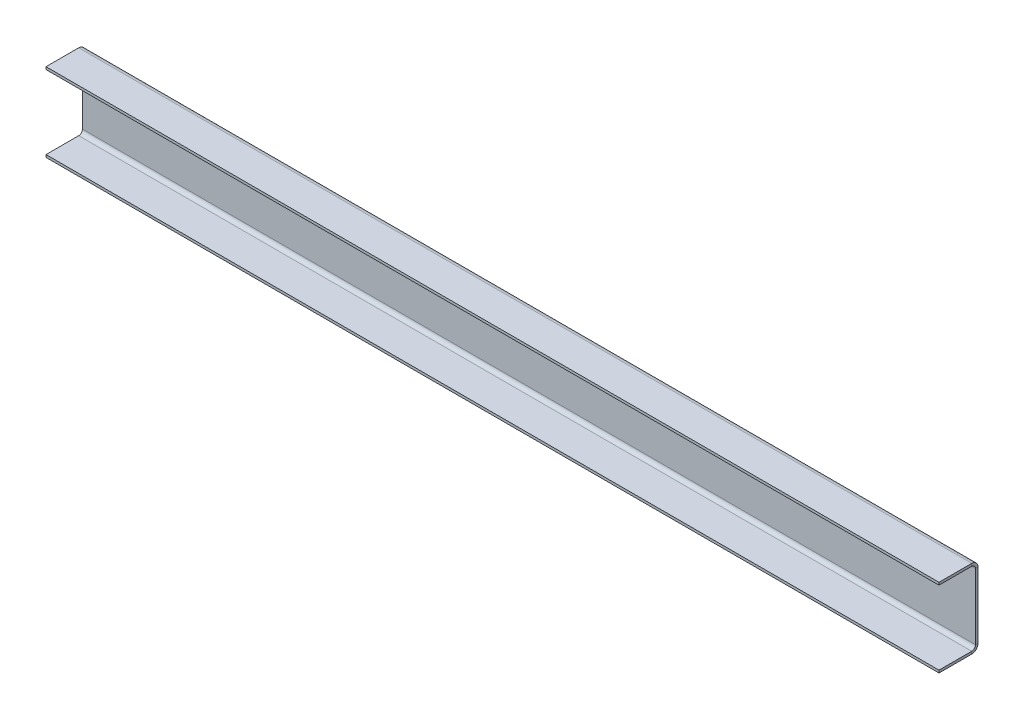
ISO-10303-21;
HEADER;
FILE_DESCRIPTION(('STEP AP214'),'2;1');
FILE_NAME('part.step','',(''),(''),'','','');
FILE_SCHEMA(('AUTOMOTIVE_DESIGN { 1 0 10303 214 1 1 1 1 }'));
ENDSEC;
DATA;
#1=APPLICATION_CONTEXT('core data for automotive mechanical design processes');
#2=APPLICATION_PROTOCOL_DEFINITION('international standard','automotive_design',2000,#1);
#3=PRODUCT_CONTEXT('',#1,'mechanical');
#4=PRODUCT('Part','Part','',(#3));
#5=PRODUCT_RELATED_PRODUCT_CATEGORY('part','',(#4));
#6=PRODUCT_DEFINITION_FORMATION('','',#4);
#7=PRODUCT_DEFINITION_CONTEXT('part definition',#1,'design');
#8=PRODUCT_DEFINITION('design','',#6,#7);
#9=PRODUCT_DEFINITION_SHAPE('','',#8);
#10=(LENGTH_UNIT() NAMED_UNIT(*) SI_UNIT(.MILLI.,.METRE.));
#11=(NAMED_UNIT(*) PLANE_ANGLE_UNIT() SI_UNIT($,.RADIAN.));
#12=(NAMED_UNIT(*) SI_UNIT($,.STERADIAN.) SOLID_ANGLE_UNIT());
#13=UNCERTAINTY_MEASURE_WITH_UNIT(LENGTH_MEASURE(1.E-05),#10,'distance_accuracy_value','');
#14=(GEOMETRIC_REPRESENTATION_CONTEXT(3) GLOBAL_UNCERTAINTY_ASSIGNED_CONTEXT((#13)) GLOBAL_UNIT_ASSIGNED_CONTEXT((#10,
#11,#12)) REPRESENTATION_CONTEXT('',''));
#15=CARTESIAN_POINT('',(0.,0.,0.));
#16=DIRECTION('',(0.,0.,1.));
#17=DIRECTION('',(1.,0.,0.));
#18=AXIS2_PLACEMENT_3D('',#15,#16,#17);
#19=CARTESIAN_POINT('',(0.,0.,-4.));
#20=DIRECTION('',(0.,0.,-1.));
#21=DIRECTION('',(-1.,0.,0.));
#22=AXIS2_PLACEMENT_3D('',#19,#20,#21);
#23=PLANE('',#22);
#24=DIRECTION('',(0.,1.,0.));
#25=VECTOR('',#24,1.);
#26=CARTESIAN_POINT('',(483.12769010043,106.886657101865,-4.00000000000045));
#27=LINE('',#26,#25);
#28=CARTESIAN_POINT('',(483.12769010043,-8.11334289813514,-4.00000000000023));
#29=VERTEX_POINT('',#28);
#30=CARTESIAN_POINT('',(483.12769010043,96.8866571018649,-4.00000000000045));
#31=VERTEX_POINT('',#30);
#32=EDGE_CURVE('E85',#29,#31,#27,.T.);
#33=ORIENTED_EDGE('',*,*,#32,.F.);
#34=DIRECTION('',(1.,0.,0.));
#35=VECTOR('',#34,1.);
#36=CARTESIAN_POINT('',(483.12769010043,-8.11334289813514,-4.00000000000023));
#37=LINE('',#36,#35);
#38=CARTESIAN_POINT('',(-936.87230989957,-8.11334289813548,-4.00000000000045));
#39=VERTEX_POINT('',#38);
#40=EDGE_CURVE('E275',#29,#39,#37,.F.);
#41=ORIENTED_EDGE('',*,*,#40,.T.);
#42=DIRECTION('',(0.,-1.,0.));
#43=VECTOR('',#42,1.);
#44=CARTESIAN_POINT('',(-936.872309899569,106.886657101865,-4.00000000000045));
#45=LINE('',#44,#43);
#46=CARTESIAN_POINT('',(-936.872309899569,96.8866571018647,-4.00000000000045));
#47=VERTEX_POINT('',#46);
#48=EDGE_CURVE('E13',#47,#39,#45,.T.);
#49=ORIENTED_EDGE('',*,*,#48,.F.);
#50=DIRECTION('',(-1.,0.,0.));
#51=VECTOR('',#50,1.);
#52=CARTESIAN_POINT('',(-936.872309899569,96.8866571018647,-4.00000000000045));
#53=LINE('',#52,#51);
#54=EDGE_CURVE('E100',#47,#31,#53,.F.);
#55=ORIENTED_EDGE('',*,*,#54,.T.);
#56=EDGE_LOOP('',(#33,#41,#49,#55));
#57=FACE_BOUND('',#56,.T.);
#58=ADVANCED_FACE('F76',(#57),#23,.T.);
#59=CARTESIAN_POINT('',(0.,0.,0.));
#60=DIRECTION('',(0.,0.,-1.));
#61=DIRECTION('',(-1.,0.,0.));
#62=AXIS2_PLACEMENT_3D('',#59,#60,#61);
#63=PLANE('',#62);
#64=DIRECTION('',(1.,0.,0.));
#65=VECTOR('',#64,1.);
#66=CARTESIAN_POINT('',(483.12769010043,-8.11334289813509,-2.22044604925031E-13));
#67=LINE('',#66,#65);
#68=CARTESIAN_POINT('',(483.12769010043,-8.11334289813509,-2.22044604925031E-13));
#69=VERTEX_POINT('',#68);
#70=CARTESIAN_POINT('',(-936.87230989957,-8.11334289813553,-3.33066907387547E-13));
#71=VERTEX_POINT('',#70);
#72=EDGE_CURVE('E192',#69,#71,#67,.F.);
#73=ORIENTED_EDGE('',*,*,#72,.F.);
#74=DIRECTION('',(0.,1.,0.));
#75=VECTOR('',#74,1.);
#76=CARTESIAN_POINT('',(483.12769010043,106.886657101865,-4.44089209850063E-13));
#77=LINE('',#76,#75);
#78=CARTESIAN_POINT('',(483.12769010043,96.8866571018649,-5.55111512312578E-13));
#79=VERTEX_POINT('',#78);
#80=EDGE_CURVE('E181',#69,#79,#77,.T.);
#81=ORIENTED_EDGE('',*,*,#80,.T.);
#82=DIRECTION('',(-1.,0.,0.));
#83=VECTOR('',#82,1.);
#84=CARTESIAN_POINT('',(-936.872309899569,96.8866571018647,-4.44089209850063E-13));
#85=LINE('',#84,#83);
#86=CARTESIAN_POINT('',(-936.872309899569,96.8866571018647,-4.44089209850063E-13));
#87=VERTEX_POINT('',#86);
#88=EDGE_CURVE('E143',#87,#79,#85,.F.);
#89=ORIENTED_EDGE('',*,*,#88,.F.);
#90=DIRECTION('',(0.,-1.,0.));
#91=VECTOR('',#90,1.);
#92=CARTESIAN_POINT('',(-936.872309899569,106.886657101865,-4.44089209850063E-13));
#93=LINE('',#92,#91);
#94=EDGE_CURVE('E80',#87,#71,#93,.T.);
#95=ORIENTED_EDGE('',*,*,#94,.T.);
#96=EDGE_LOOP('',(#73,#81,#89,#95));
#97=FACE_BOUND('',#96,.T.);
#98=ADVANCED_FACE('F189',(#97),#63,.F.);
#99=CARTESIAN_POINT('',(483.12769010043,106.886657101865,-4.00000000000045));
#100=DIRECTION('',(1.,0.,0.));
#101=DIRECTION('',(0.,0.,-1.));
#102=AXIS2_PLACEMENT_3D('',#99,#100,#101);
#103=PLANE('',#102);
#104=ORIENTED_EDGE('',*,*,#80,.F.);
#105=DIRECTION('',(0.,0.,-1.));
#106=VECTOR('',#105,1.);
#107=CARTESIAN_POINT('',(483.12769010043,-8.11334289813509,-2.22044604925031E-13));
#108=LINE('',#107,#106);
#109=EDGE_CURVE('E205',#69,#29,#108,.T.);
#110=ORIENTED_EDGE('',*,*,#109,.T.);
#111=ORIENTED_EDGE('',*,*,#32,.T.);
#112=DIRECTION('',(0.,0.,-1.));
#113=VECTOR('',#112,1.);
#114=CARTESIAN_POINT('',(483.12769010043,96.8866571018649,-5.55111512312578E-13));
#115=LINE('',#114,#113);
#116=EDGE_CURVE('E178',#79,#31,#115,.T.);
#117=ORIENTED_EDGE('',*,*,#116,.F.);
#118=EDGE_LOOP('',(#104,#110,#111,#117));
#119=FACE_BOUND('',#118,.T.);
#120=ADVANCED_FACE('F78',(#119),#103,.T.);
#121=CARTESIAN_POINT('',(-936.872309899569,106.886657101865,-4.00000000000045));
#122=DIRECTION('',(-1.,0.,0.));
#123=DIRECTION('',(0.,0.,1.));
#124=AXIS2_PLACEMENT_3D('',#121,#122,#123);
#125=PLANE('',#124);
#126=DIRECTION('',(0.,0.,-1.));
#127=VECTOR('',#126,1.);
#128=CARTESIAN_POINT('',(-936.87230989957,-8.11334289813553,-3.33066907387547E-13));
#129=LINE('',#128,#127);
#130=EDGE_CURVE('E169',#71,#39,#129,.T.);
#131=ORIENTED_EDGE('',*,*,#130,.F.);
#132=ORIENTED_EDGE('',*,*,#94,.F.);
#133=DIRECTION('',(0.,0.,-1.));
#134=VECTOR('',#133,1.);
#135=CARTESIAN_POINT('',(-936.872309899569,96.8866571018647,-4.44089209850063E-13));
#136=LINE('',#135,#134);
#137=EDGE_CURVE('E142',#87,#47,#136,.T.);
#138=ORIENTED_EDGE('',*,*,#137,.T.);
#139=ORIENTED_EDGE('',*,*,#48,.T.);
#140=EDGE_LOOP('',(#131,#132,#138,#139));
#141=FACE_BOUND('',#140,.T.);
#142=ADVANCED_FACE('F197',(#141),#125,.T.);
#143=CARTESIAN_POINT('',(483.12769010043,96.886657101865,5.99999999999989));
#144=DIRECTION('',(1.,0.,0.));
#145=DIRECTION('',(0.,0.,-1.));
#146=AXIS2_PLACEMENT_3D('',#143,#144,#145);
#147=PLANE('',#146);
#148=DIRECTION('',(0.,1.,0.));
#149=VECTOR('',#148,1.);
#150=CARTESIAN_POINT('',(483.12769010043,106.886657101865,5.99999999999989));
#151=LINE('',#150,#149);
#152=CARTESIAN_POINT('',(483.12769010043,102.886657101865,5.99999999999989));
#153=VERTEX_POINT('',#152);
#154=CARTESIAN_POINT('',(483.12769010043,106.886657101865,5.99999999999989));
#155=VERTEX_POINT('',#154);
#156=EDGE_CURVE('E134',#153,#155,#151,.T.);
#157=ORIENTED_EDGE('',*,*,#156,.F.);
#158=CARTESIAN_POINT('',(483.12769010043,96.886657101865,5.99999999999989));
#159=DIRECTION('',(-1.,0.,0.));
#160=DIRECTION('',(0.,0.,1.));
#161=AXIS2_PLACEMENT_3D('',#158,#159,#160);
#162=CIRCLE('',#161,6.0000000000001);
#163=EDGE_CURVE('E128',#79,#153,#162,.F.);
#164=ORIENTED_EDGE('',*,*,#163,.F.);
#165=ORIENTED_EDGE('',*,*,#116,.T.);
#166=CARTESIAN_POINT('',(483.12769010043,96.886657101865,5.99999999999989));
#167=DIRECTION('',(-1.,0.,0.));
#168=DIRECTION('',(0.,0.,1.));
#169=AXIS2_PLACEMENT_3D('',#166,#167,#168);
#170=CIRCLE('',#169,10.0000000000001);
#171=EDGE_CURVE('E171',#31,#155,#170,.F.);
#172=ORIENTED_EDGE('',*,*,#171,.T.);
#173=EDGE_LOOP('',(#157,#164,#165,#172));
#174=FACE_BOUND('',#173,.T.);
#175=ADVANCED_FACE('F356',(#174),#147,.T.);
#176=CARTESIAN_POINT('',(-936.872309899569,96.8866571018648,5.99999999999989));
#177=DIRECTION('',(1.,0.,0.));
#178=DIRECTION('',(0.,0.,-1.));
#179=AXIS2_PLACEMENT_3D('',#176,#177,#178);
#180=PLANE('',#179);
#181=CARTESIAN_POINT('',(-936.872309899569,96.8866571018648,5.99999999999989));
#182=DIRECTION('',(-1.,0.,0.));
#183=DIRECTION('',(0.,0.,1.));
#184=AXIS2_PLACEMENT_3D('',#181,#182,#183);
#185=CIRCLE('',#184,6.0000000000001);
#186=CARTESIAN_POINT('',(-936.872309899569,102.886657101865,5.99999999999989));
#187=VERTEX_POINT('',#186);
#188=EDGE_CURVE('E125',#187,#87,#185,.T.);
#189=ORIENTED_EDGE('',*,*,#188,.F.);
#190=DIRECTION('',(0.,1.,0.));
#191=VECTOR('',#190,1.);
#192=CARTESIAN_POINT('',(-936.872309899569,102.886657101865,5.99999999999989));
#193=LINE('',#192,#191);
#194=CARTESIAN_POINT('',(-936.872309899569,106.886657101865,5.99999999999989));
#195=VERTEX_POINT('',#194);
#196=EDGE_CURVE('E133',#187,#195,#193,.T.);
#197=ORIENTED_EDGE('',*,*,#196,.T.);
#198=CARTESIAN_POINT('',(-936.872309899569,96.8866571018648,5.99999999999989));
#199=DIRECTION('',(-1.,0.,0.));
#200=DIRECTION('',(0.,0.,1.));
#201=AXIS2_PLACEMENT_3D('',#198,#199,#200);
#202=CIRCLE('',#201,10.0000000000001);
#203=EDGE_CURVE('E172',#195,#47,#202,.T.);
#204=ORIENTED_EDGE('',*,*,#203,.T.);
#205=ORIENTED_EDGE('',*,*,#137,.F.);
#206=EDGE_LOOP('',(#189,#197,#204,#205));
#207=FACE_BOUND('',#206,.T.);
#208=ADVANCED_FACE('F138',(#207),#180,.F.);
#209=CARTESIAN_POINT('',(-936.872309899569,96.8866571018648,5.99999999999989));
#210=DIRECTION('',(-1.,0.,0.));
#211=DIRECTION('',(0.,1.,0.));
#212=AXIS2_PLACEMENT_3D('',#209,#210,#211);
#213=CYLINDRICAL_SURFACE('',#212,10.0000000000001);
#214=ORIENTED_EDGE('',*,*,#54,.F.);
#215=ORIENTED_EDGE('',*,*,#203,.F.);
#216=DIRECTION('',(-1.,0.,0.));
#217=VECTOR('',#216,1.);
#218=CARTESIAN_POINT('',(-1.11022302462516E-13,106.886657101865,6.00000000000001));
#219=LINE('',#218,#217);
#220=EDGE_CURVE('E161',#155,#195,#219,.T.);
#221=ORIENTED_EDGE('',*,*,#220,.F.);
#222=ORIENTED_EDGE('',*,*,#171,.F.);
#223=EDGE_LOOP('',(#214,#215,#221,#222));
#224=FACE_BOUND('',#223,.T.);
#225=ADVANCED_FACE('F366',(#224),#213,.T.);
#226=CARTESIAN_POINT('',(-936.872309899569,96.8866571018648,5.99999999999989));
#227=DIRECTION('',(-1.,0.,0.));
#228=DIRECTION('',(0.,1.,0.));
#229=AXIS2_PLACEMENT_3D('',#226,#227,#228);
#230=CYLINDRICAL_SURFACE('',#229,6.0000000000001);
#231=ORIENTED_EDGE('',*,*,#88,.T.);
#232=ORIENTED_EDGE('',*,*,#163,.T.);
#233=DIRECTION('',(1.,0.,0.));
#234=VECTOR('',#233,1.);
#235=CARTESIAN_POINT('',(483.12769010043,102.886657101865,5.99999999999989));
#236=LINE('',#235,#234);
#237=EDGE_CURVE('E121',#153,#187,#236,.F.);
#238=ORIENTED_EDGE('',*,*,#237,.T.);
#239=ORIENTED_EDGE('',*,*,#188,.T.);
#240=EDGE_LOOP('',(#231,#232,#238,#239));
#241=FACE_BOUND('',#240,.T.);
#242=ADVANCED_FACE('F124',(#241),#230,.F.);
#243=CARTESIAN_POINT('',(-936.872309899569,106.886657101865,-4.44089209850063E-13));
#244=DIRECTION('',(-1.,0.,0.));
#245=DIRECTION('',(0.,-1.,0.));
#246=AXIS2_PLACEMENT_3D('',#243,#244,#245);
#247=PLANE('',#246);
#248=DIRECTION('',(0.,0.,-1.));
#249=VECTOR('',#248,1.);
#250=CARTESIAN_POINT('',(-936.872309899569,106.886657101865,-4.44089209850063E-13));
#251=LINE('',#250,#249);
#252=CARTESIAN_POINT('',(-936.87230989957,106.886657101865,57.9999999999999));
#253=VERTEX_POINT('',#252);
#254=EDGE_CURVE('E160',#253,#195,#251,.T.);
#255=ORIENTED_EDGE('',*,*,#254,.T.);
#256=ORIENTED_EDGE('',*,*,#196,.F.);
#257=DIRECTION('',(0.,0.,1.));
#258=VECTOR('',#257,1.);
#259=CARTESIAN_POINT('',(-936.872309899569,102.886657101865,-7.7715611723761E-13));
#260=LINE('',#259,#258);
#261=CARTESIAN_POINT('',(-936.87230989957,102.886657101865,57.9999999999999));
#262=VERTEX_POINT('',#261);
#263=EDGE_CURVE('E148',#262,#187,#260,.F.);
#264=ORIENTED_EDGE('',*,*,#263,.F.);
#265=DIRECTION('',(0.,-1.,0.));
#266=VECTOR('',#265,1.);
#267=CARTESIAN_POINT('',(-936.87230989957,106.886657101865,57.9999999999999));
#268=LINE('',#267,#266);
#269=EDGE_CURVE('E144',#253,#262,#268,.T.);
#270=ORIENTED_EDGE('',*,*,#269,.F.);
#271=EDGE_LOOP('',(#255,#256,#264,#270));
#272=FACE_BOUND('',#271,.T.);
#273=ADVANCED_FACE('F158',(#272),#247,.T.);
#274=CARTESIAN_POINT('',(483.12769010043,106.886657101865,57.9999999999999));
#275=DIRECTION('',(1.,0.,0.));
#276=DIRECTION('',(0.,1.,0.));
#277=AXIS2_PLACEMENT_3D('',#274,#275,#276);
#278=PLANE('',#277);
#279=DIRECTION('',(0.,0.,-1.));
#280=VECTOR('',#279,1.);
#281=CARTESIAN_POINT('',(483.12769010043,102.886657101865,-7.7715611723761E-13));
#282=LINE('',#281,#280);
#283=CARTESIAN_POINT('',(483.12769010043,102.886657101865,57.9999999999999));
#284=VERTEX_POINT('',#283);
#285=EDGE_CURVE('E163',#153,#284,#282,.F.);
#286=ORIENTED_EDGE('',*,*,#285,.F.);
#287=ORIENTED_EDGE('',*,*,#156,.T.);
#288=DIRECTION('',(0.,0.,1.));
#289=VECTOR('',#288,1.);
#290=CARTESIAN_POINT('',(483.12769010043,106.886657101865,57.9999999999999));
#291=LINE('',#290,#289);
#292=CARTESIAN_POINT('',(483.12769010043,106.886657101865,57.9999999999999));
#293=VERTEX_POINT('',#292);
#294=EDGE_CURVE('E155',#155,#293,#291,.T.);
#295=ORIENTED_EDGE('',*,*,#294,.T.);
#296=DIRECTION('',(0.,-1.,0.));
#297=VECTOR('',#296,1.);
#298=CARTESIAN_POINT('',(483.12769010043,106.886657101865,57.9999999999999));
#299=LINE('',#298,#297);
#300=EDGE_CURVE('E215',#293,#284,#299,.T.);
#301=ORIENTED_EDGE('',*,*,#300,.T.);
#302=EDGE_LOOP('',(#286,#287,#295,#301));
#303=FACE_BOUND('',#302,.T.);
#304=ADVANCED_FACE('F227',(#303),#278,.T.);
#305=CARTESIAN_POINT('',(0.,106.886657101865,-3.33066907387547E-13));
#306=DIRECTION('',(0.,1.,0.));
#307=DIRECTION('',(0.,0.,1.));
#308=AXIS2_PLACEMENT_3D('',#305,#306,#307);
#309=PLANE('',#308);
#310=ORIENTED_EDGE('',*,*,#294,.F.);
#311=ORIENTED_EDGE('',*,*,#220,.T.);
#312=ORIENTED_EDGE('',*,*,#254,.F.);
#313=DIRECTION('',(-1.,0.,0.));
#314=VECTOR('',#313,1.);
#315=CARTESIAN_POINT('',(-936.87230989957,106.886657101865,57.9999999999999));
#316=LINE('',#315,#314);
#317=EDGE_CURVE('E219',#293,#253,#316,.T.);
#318=ORIENTED_EDGE('',*,*,#317,.F.);
#319=EDGE_LOOP('',(#310,#311,#312,#318));
#320=FACE_BOUND('',#319,.T.);
#321=ADVANCED_FACE('F365',(#320),#309,.T.);
#322=CARTESIAN_POINT('',(0.,102.886657101865,-3.33066907387547E-13));
#323=DIRECTION('',(0.,1.,0.));
#324=DIRECTION('',(0.,0.,1.));
#325=AXIS2_PLACEMENT_3D('',#322,#323,#324);
#326=PLANE('',#325);
#327=ORIENTED_EDGE('',*,*,#237,.F.);
#328=ORIENTED_EDGE('',*,*,#285,.T.);
#329=DIRECTION('',(1.,0.,0.));
#330=VECTOR('',#329,1.);
#331=CARTESIAN_POINT('',(0.,102.886657101865,58.));
#332=LINE('',#331,#330);
#333=EDGE_CURVE('E152',#284,#262,#332,.F.);
#334=ORIENTED_EDGE('',*,*,#333,.T.);
#335=ORIENTED_EDGE('',*,*,#263,.T.);
#336=EDGE_LOOP('',(#327,#328,#334,#335));
#337=FACE_BOUND('',#336,.T.);
#338=ADVANCED_FACE('F149',(#337),#326,.F.);
#339=CARTESIAN_POINT('',(-936.87230989957,106.886657101865,57.9999999999999));
#340=DIRECTION('',(0.,0.,1.));
#341=DIRECTION('',(0.,-1.,0.));
#342=AXIS2_PLACEMENT_3D('',#339,#340,#341);
#343=PLANE('',#342);
#344=ORIENTED_EDGE('',*,*,#333,.F.);
#345=ORIENTED_EDGE('',*,*,#300,.F.);
#346=ORIENTED_EDGE('',*,*,#317,.T.);
#347=ORIENTED_EDGE('',*,*,#269,.T.);
#348=EDGE_LOOP('',(#344,#345,#346,#347));
#349=FACE_BOUND('',#348,.T.);
#350=ADVANCED_FACE('F232',(#349),#343,.T.);
#351=CARTESIAN_POINT('',(-936.87230989957,-8.11334289813542,5.99999999999989));
#352=DIRECTION('',(-1.,0.,0.));
#353=DIRECTION('',(0.,-1.,0.));
#354=AXIS2_PLACEMENT_3D('',#351,#352,#353);
#355=PLANE('',#354);
#356=DIRECTION('',(0.,-1.,0.));
#357=VECTOR('',#356,1.);
#358=CARTESIAN_POINT('',(-936.872309899569,-18.1133428981353,5.99999999999989));
#359=LINE('',#358,#357);
#360=CARTESIAN_POINT('',(-936.87230989957,-14.1133428981353,5.99999999999989));
#361=VERTEX_POINT('',#360);
#362=CARTESIAN_POINT('',(-936.872309899569,-18.1133428981353,5.99999999999989));
#363=VERTEX_POINT('',#362);
#364=EDGE_CURVE('E318',#361,#363,#359,.T.);
#365=ORIENTED_EDGE('',*,*,#364,.F.);
#366=CARTESIAN_POINT('',(-936.87230989957,-8.11334289813542,5.99999999999989));
#367=DIRECTION('',(1.,0.,0.));
#368=DIRECTION('',(0.,1.,0.));
#369=AXIS2_PLACEMENT_3D('',#366,#367,#368);
#370=CIRCLE('',#369,5.99999999999988);
#371=EDGE_CURVE('E277',#71,#361,#370,.F.);
#372=ORIENTED_EDGE('',*,*,#371,.F.);
#373=ORIENTED_EDGE('',*,*,#130,.T.);
#374=CARTESIAN_POINT('',(-936.87230989957,-8.11334289813542,5.99999999999989));
#375=DIRECTION('',(1.,0.,0.));
#376=DIRECTION('',(0.,1.,0.));
#377=AXIS2_PLACEMENT_3D('',#374,#375,#376);
#378=CIRCLE('',#377,9.99999999999988);
#379=EDGE_CURVE('E207',#39,#363,#378,.F.);
#380=ORIENTED_EDGE('',*,*,#379,.T.);
#381=EDGE_LOOP('',(#365,#372,#373,#380));
#382=FACE_BOUND('',#381,.T.);
#383=ADVANCED_FACE('F335',(#382),#355,.T.);
#384=CARTESIAN_POINT('',(483.12769010043,-8.11334289813498,5.99999999999989));
#385=DIRECTION('',(-1.,0.,0.));
#386=DIRECTION('',(0.,-1.,0.));
#387=AXIS2_PLACEMENT_3D('',#384,#385,#386);
#388=PLANE('',#387);
#389=CARTESIAN_POINT('',(483.12769010043,-8.11334289813498,5.99999999999989));
#390=DIRECTION('',(1.,0.,0.));
#391=DIRECTION('',(0.,1.,0.));
#392=AXIS2_PLACEMENT_3D('',#389,#390,#391);
#393=CIRCLE('',#392,5.99999999999988);
#394=CARTESIAN_POINT('',(483.12769010043,-14.1133428981349,5.99999999999989));
#395=VERTEX_POINT('',#394);
#396=EDGE_CURVE('E210',#395,#69,#393,.T.);
#397=ORIENTED_EDGE('',*,*,#396,.F.);
#398=DIRECTION('',(0.,-1.,0.));
#399=VECTOR('',#398,1.);
#400=CARTESIAN_POINT('',(483.12769010043,-14.1133428981351,5.99999999999989));
#401=LINE('',#400,#399);
#402=CARTESIAN_POINT('',(483.12769010043,-18.1133428981351,5.99999999999989));
#403=VERTEX_POINT('',#402);
#404=EDGE_CURVE('E281',#395,#403,#401,.T.);
#405=ORIENTED_EDGE('',*,*,#404,.T.);
#406=CARTESIAN_POINT('',(483.12769010043,-8.11334289813498,5.99999999999989));
#407=DIRECTION('',(1.,0.,0.));
#408=DIRECTION('',(0.,1.,0.));
#409=AXIS2_PLACEMENT_3D('',#406,#407,#408);
#410=CIRCLE('',#409,9.99999999999988);
#411=EDGE_CURVE('E270',#403,#29,#410,.T.);
#412=ORIENTED_EDGE('',*,*,#411,.T.);
#413=ORIENTED_EDGE('',*,*,#109,.F.);
#414=EDGE_LOOP('',(#397,#405,#412,#413));
#415=FACE_BOUND('',#414,.T.);
#416=ADVANCED_FACE('F282',(#415),#388,.F.);
#417=CARTESIAN_POINT('',(483.12769010043,-8.11334289813498,5.99999999999989));
#418=DIRECTION('',(1.,0.,0.));
#419=DIRECTION('',(0.,-1.,0.));
#420=AXIS2_PLACEMENT_3D('',#417,#418,#419);
#421=CYLINDRICAL_SURFACE('',#420,9.99999999999988);
#422=ORIENTED_EDGE('',*,*,#40,.F.);
#423=ORIENTED_EDGE('',*,*,#411,.F.);
#424=DIRECTION('',(1.,0.,0.));
#425=VECTOR('',#424,1.);
#426=CARTESIAN_POINT('',(-3.88578058618805E-13,-18.1133428981349,6.00000000000001));
#427=LINE('',#426,#425);
#428=EDGE_CURVE('E274',#363,#403,#427,.T.);
#429=ORIENTED_EDGE('',*,*,#428,.F.);
#430=ORIENTED_EDGE('',*,*,#379,.F.);
#431=EDGE_LOOP('',(#422,#423,#429,#430));
#432=FACE_BOUND('',#431,.T.);
#433=ADVANCED_FACE('F272',(#432),#421,.T.);
#434=CARTESIAN_POINT('',(483.12769010043,-8.11334289813498,5.99999999999989));
#435=DIRECTION('',(1.,0.,0.));
#436=DIRECTION('',(0.,-1.,0.));
#437=AXIS2_PLACEMENT_3D('',#434,#435,#436);
#438=CYLINDRICAL_SURFACE('',#437,5.99999999999988);
#439=ORIENTED_EDGE('',*,*,#72,.T.);
#440=ORIENTED_EDGE('',*,*,#371,.T.);
#441=DIRECTION('',(-1.,0.,0.));
#442=VECTOR('',#441,1.);
#443=CARTESIAN_POINT('',(-936.87230989957,-14.1133428981353,5.99999999999989));
#444=LINE('',#443,#442);
#445=EDGE_CURVE('E288',#361,#395,#444,.F.);
#446=ORIENTED_EDGE('',*,*,#445,.T.);
#447=ORIENTED_EDGE('',*,*,#396,.T.);
#448=EDGE_LOOP('',(#439,#440,#446,#447));
#449=FACE_BOUND('',#448,.T.);
#450=ADVANCED_FACE('F336',(#449),#438,.F.);
#451=CARTESIAN_POINT('',(483.12769010043,-18.113342898135,-4.44089209850063E-13));
#452=DIRECTION('',(1.,0.,0.));
#453=DIRECTION('',(0.,1.,0.));
#454=AXIS2_PLACEMENT_3D('',#451,#452,#453);
#455=PLANE('',#454);
#456=DIRECTION('',(0.,0.,-1.));
#457=VECTOR('',#456,1.);
#458=CARTESIAN_POINT('',(483.12769010043,-18.113342898135,-4.44089209850063E-13));
#459=LINE('',#458,#457);
#460=CARTESIAN_POINT('',(483.12769010043,-18.1133428981353,57.9999999999999));
#461=VERTEX_POINT('',#460);
#462=EDGE_CURVE('E295',#461,#403,#459,.T.);
#463=ORIENTED_EDGE('',*,*,#462,.T.);
#464=ORIENTED_EDGE('',*,*,#404,.F.);
#465=DIRECTION('',(0.,0.,1.));
#466=VECTOR('',#465,1.);
#467=CARTESIAN_POINT('',(483.12769010043,-14.113342898135,-4.44089209850063E-13));
#468=LINE('',#467,#466);
#469=CARTESIAN_POINT('',(483.12769010043,-14.1133428981353,57.9999999999999));
#470=VERTEX_POINT('',#469);
#471=EDGE_CURVE('E311',#470,#395,#468,.F.);
#472=ORIENTED_EDGE('',*,*,#471,.F.);
#473=DIRECTION('',(0.,1.,0.));
#474=VECTOR('',#473,1.);
#475=CARTESIAN_POINT('',(483.12769010043,-18.1133428981353,57.9999999999999));
#476=LINE('',#475,#474);
#477=EDGE_CURVE('E300',#461,#470,#476,.T.);
#478=ORIENTED_EDGE('',*,*,#477,.F.);
#479=EDGE_LOOP('',(#463,#464,#472,#478));
#480=FACE_BOUND('',#479,.T.);
#481=ADVANCED_FACE('F299',(#480),#455,.T.);
#482=CARTESIAN_POINT('',(-936.87230989957,-18.1133428981354,57.9999999999999));
#483=DIRECTION('',(-1.,0.,0.));
#484=DIRECTION('',(0.,-1.,0.));
#485=AXIS2_PLACEMENT_3D('',#482,#483,#484);
#486=PLANE('',#485);
#487=DIRECTION('',(0.,0.,-1.));
#488=VECTOR('',#487,1.);
#489=CARTESIAN_POINT('',(-936.87230989957,-14.1133428981353,-4.44089209850063E-13));
#490=LINE('',#489,#488);
#491=CARTESIAN_POINT('',(-936.872309899571,-14.1133428981354,57.9999999999999));
#492=VERTEX_POINT('',#491);
#493=EDGE_CURVE('E297',#361,#492,#490,.F.);
#494=ORIENTED_EDGE('',*,*,#493,.F.);
#495=ORIENTED_EDGE('',*,*,#364,.T.);
#496=DIRECTION('',(0.,0.,1.));
#497=VECTOR('',#496,1.);
#498=CARTESIAN_POINT('',(-936.87230989957,-18.1133428981354,57.9999999999999));
#499=LINE('',#498,#497);
#500=CARTESIAN_POINT('',(-936.87230989957,-18.1133428981354,57.9999999999999));
#501=VERTEX_POINT('',#500);
#502=EDGE_CURVE('E296',#363,#501,#499,.T.);
#503=ORIENTED_EDGE('',*,*,#502,.T.);
#504=DIRECTION('',(0.,1.,0.));
#505=VECTOR('',#504,1.);
#506=CARTESIAN_POINT('',(-936.87230989957,-18.1133428981354,57.9999999999999));
#507=LINE('',#506,#505);
#508=EDGE_CURVE('E302',#501,#492,#507,.T.);
#509=ORIENTED_EDGE('',*,*,#508,.T.);
#510=EDGE_LOOP('',(#494,#495,#503,#509));
#511=FACE_BOUND('',#510,.T.);
#512=ADVANCED_FACE('F334',(#511),#486,.T.);
#513=CARTESIAN_POINT('',(0.,-18.1133428981349,-1.11022302462516E-13));
#514=DIRECTION('',(0.,-1.,0.));
#515=DIRECTION('',(0.,0.,-1.));
#516=AXIS2_PLACEMENT_3D('',#513,#514,#515);
#517=PLANE('',#516);
#518=ORIENTED_EDGE('',*,*,#502,.F.);
#519=ORIENTED_EDGE('',*,*,#428,.T.);
#520=ORIENTED_EDGE('',*,*,#462,.F.);
#521=DIRECTION('',(1.,0.,0.));
#522=VECTOR('',#521,1.);
#523=CARTESIAN_POINT('',(483.12769010043,-18.1133428981353,57.9999999999999));
#524=LINE('',#523,#522);
#525=EDGE_CURVE('E303',#501,#461,#524,.T.);
#526=ORIENTED_EDGE('',*,*,#525,.F.);
#527=EDGE_LOOP('',(#518,#519,#520,#526));
#528=FACE_BOUND('',#527,.T.);
#529=ADVANCED_FACE('F293',(#528),#517,.T.);
#530=CARTESIAN_POINT('',(0.,-14.1133428981349,-1.11022302462516E-13));
#531=DIRECTION('',(0.,-1.,0.));
#532=DIRECTION('',(0.,0.,-1.));
#533=AXIS2_PLACEMENT_3D('',#530,#531,#532);
#534=PLANE('',#533);
#535=ORIENTED_EDGE('',*,*,#445,.F.);
#536=ORIENTED_EDGE('',*,*,#493,.T.);
#537=DIRECTION('',(-1.,0.,0.));
#538=VECTOR('',#537,1.);
#539=CARTESIAN_POINT('',(0.,-14.1133428981352,58.));
#540=LINE('',#539,#538);
#541=EDGE_CURVE('E313',#492,#470,#540,.F.);
#542=ORIENTED_EDGE('',*,*,#541,.T.);
#543=ORIENTED_EDGE('',*,*,#471,.T.);
#544=EDGE_LOOP('',(#535,#536,#542,#543));
#545=FACE_BOUND('',#544,.T.);
#546=ADVANCED_FACE('F331',(#545),#534,.F.);
#547=CARTESIAN_POINT('',(483.12769010043,-18.1133428981353,57.9999999999999));
#548=DIRECTION('',(0.,0.,1.));
#549=DIRECTION('',(0.,-1.,0.));
#550=AXIS2_PLACEMENT_3D('',#547,#548,#549);
#551=PLANE('',#550);
#552=ORIENTED_EDGE('',*,*,#541,.F.);
#553=ORIENTED_EDGE('',*,*,#508,.F.);
#554=ORIENTED_EDGE('',*,*,#525,.T.);
#555=ORIENTED_EDGE('',*,*,#477,.T.);
#556=EDGE_LOOP('',(#552,#553,#554,#555));
#557=FACE_BOUND('',#556,.T.);
#558=ADVANCED_FACE('F327',(#557),#551,.T.);
#559=CLOSED_SHELL('',(#58,#98,#120,#142,#175,#208,#225,#242,#273,#304,#321,#338,#350,#383,#416,
#433,#450,#481,#512,#529,#546,#558));
#560=MANIFOLD_SOLID_BREP('B2',#559);
#561=ADVANCED_BREP_SHAPE_REPRESENTATION('',(#18,#560),#14);
#562=SHAPE_DEFINITION_REPRESENTATION(#9,#561);
ENDSEC;
END-ISO-10303-21;
